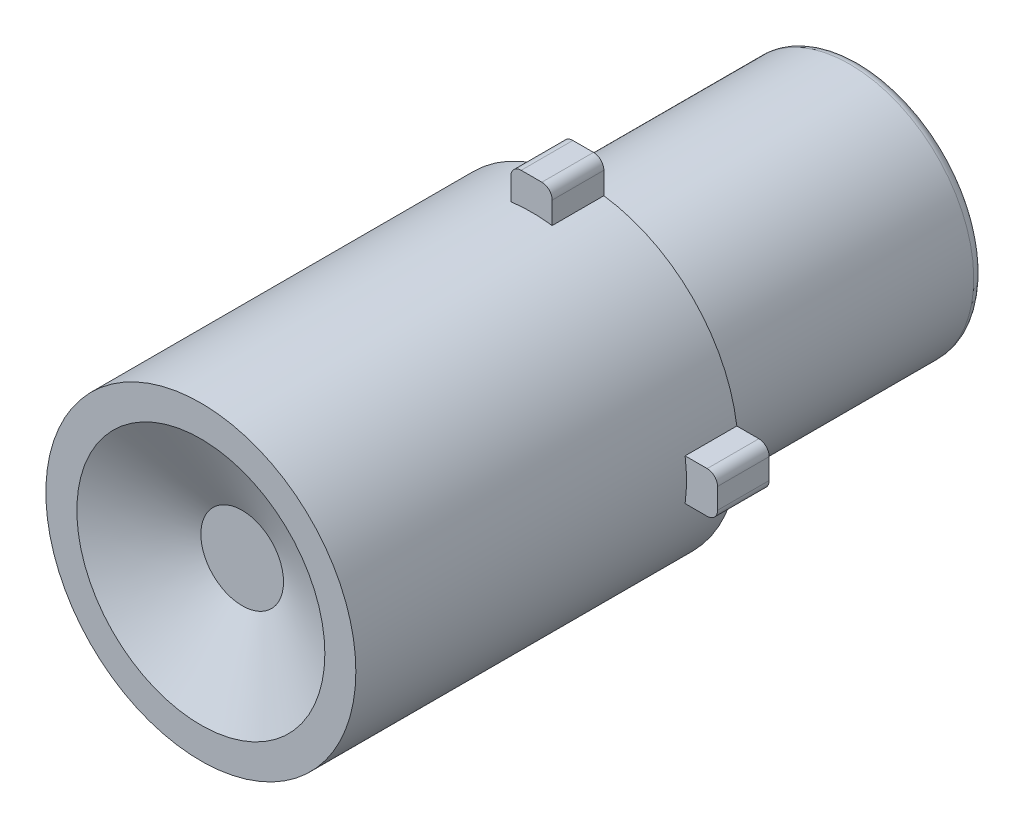
ISO-10303-21;
HEADER;
FILE_DESCRIPTION(('STEP AP214'),'2;1');
FILE_NAME('part.step','',(''),(''),'','','');
FILE_SCHEMA(('AUTOMOTIVE_DESIGN { 1 0 10303 214 1 1 1 1 }'));
ENDSEC;
DATA;
#1=APPLICATION_CONTEXT('core data for automotive mechanical design processes');
#2=APPLICATION_PROTOCOL_DEFINITION('international standard','automotive_design',2000,#1);
#3=PRODUCT_CONTEXT('',#1,'mechanical');
#4=PRODUCT('Part','Part','',(#3));
#5=PRODUCT_RELATED_PRODUCT_CATEGORY('part','',(#4));
#6=PRODUCT_DEFINITION_FORMATION('','',#4);
#7=PRODUCT_DEFINITION_CONTEXT('part definition',#1,'design');
#8=PRODUCT_DEFINITION('design','',#6,#7);
#9=PRODUCT_DEFINITION_SHAPE('','',#8);
#10=(LENGTH_UNIT() NAMED_UNIT(*) SI_UNIT(.MILLI.,.METRE.));
#11=(NAMED_UNIT(*) PLANE_ANGLE_UNIT() SI_UNIT($,.RADIAN.));
#12=(NAMED_UNIT(*) SI_UNIT($,.STERADIAN.) SOLID_ANGLE_UNIT());
#13=UNCERTAINTY_MEASURE_WITH_UNIT(LENGTH_MEASURE(1.E-05),#10,'distance_accuracy_value','');
#14=(GEOMETRIC_REPRESENTATION_CONTEXT(3) GLOBAL_UNCERTAINTY_ASSIGNED_CONTEXT((#13)) GLOBAL_UNIT_ASSIGNED_CONTEXT((#10,
#11,#12)) REPRESENTATION_CONTEXT('',''));
#15=CARTESIAN_POINT('',(0.,0.,0.));
#16=DIRECTION('',(0.,0.,1.));
#17=DIRECTION('',(1.,0.,0.));
#18=AXIS2_PLACEMENT_3D('',#15,#16,#17);
#19=CARTESIAN_POINT('',(0.,0.,10.));
#20=DIRECTION('',(0.,0.,-1.));
#21=DIRECTION('',(-1.,0.,0.));
#22=AXIS2_PLACEMENT_3D('',#19,#20,#21);
#23=CYLINDRICAL_SURFACE('',#22,3.75);
#24=CARTESIAN_POINT('',(0.,0.,10.));
#25=DIRECTION('',(0.,0.,1.));
#26=DIRECTION('',(1.,0.,0.));
#27=AXIS2_PLACEMENT_3D('',#24,#25,#26);
#28=CIRCLE('',#27,3.75);
#29=CARTESIAN_POINT('',(3.75,0.,10.));
#30=VERTEX_POINT('',#29);
#31=EDGE_CURVE('E303',#30,#30,#28,.T.);
#32=ORIENTED_EDGE('',*,*,#31,.F.);
#33=EDGE_LOOP('',(#32));
#34=FACE_BOUND('',#33,.T.);
#35=CARTESIAN_POINT('',(0.,0.,0.750000000000001));
#36=DIRECTION('',(0.,0.,-1.));
#37=DIRECTION('',(0.,1.,0.));
#38=AXIS2_PLACEMENT_3D('',#35,#36,#37);
#39=CIRCLE('',#38,3.75);
#40=CARTESIAN_POINT('',(0.5,3.71651718682963,0.750000000000001));
#41=VERTEX_POINT('',#40);
#42=CARTESIAN_POINT('',(3.71651718682963,0.5,0.749999999999999));
#43=VERTEX_POINT('',#42);
#44=EDGE_CURVE('E226',#41,#43,#39,.T.);
#45=ORIENTED_EDGE('',*,*,#44,.F.);
#46=DIRECTION('',(0.,0.,-1.));
#47=VECTOR('',#46,1.);
#48=CARTESIAN_POINT('',(0.5,3.71651718682963,10.));
#49=LINE('',#48,#47);
#50=CARTESIAN_POINT('',(0.5,3.71651718682963,2.));
#51=VERTEX_POINT('',#50);
#52=EDGE_CURVE('E268',#41,#51,#49,.F.);
#53=ORIENTED_EDGE('',*,*,#52,.T.);
#54=CARTESIAN_POINT('',(0.,0.,2.));
#55=DIRECTION('',(0.,0.,-1.));
#56=DIRECTION('',(-1.,0.,0.));
#57=AXIS2_PLACEMENT_3D('',#54,#55,#56);
#58=CIRCLE('',#57,3.75);
#59=CARTESIAN_POINT('',(-0.5,3.71651718682963,2.));
#60=VERTEX_POINT('',#59);
#61=EDGE_CURVE('E310',#60,#51,#58,.T.);
#62=ORIENTED_EDGE('',*,*,#61,.F.);
#63=DIRECTION('',(0.,0.,-1.));
#64=VECTOR('',#63,1.);
#65=CARTESIAN_POINT('',(-0.5,3.71651718682963,10.));
#66=LINE('',#65,#64);
#67=CARTESIAN_POINT('',(-0.5,3.71651718682963,0.750000000000001));
#68=VERTEX_POINT('',#67);
#69=EDGE_CURVE('E272',#60,#68,#66,.T.);
#70=ORIENTED_EDGE('',*,*,#69,.T.);
#71=CARTESIAN_POINT('',(-3.71651718682963,0.5,0.749999999999999));
#72=VERTEX_POINT('',#71);
#73=EDGE_CURVE('E486',#72,#68,#39,.T.);
#74=ORIENTED_EDGE('',*,*,#73,.F.);
#75=DIRECTION('',(0.,0.,-1.));
#76=VECTOR('',#75,1.);
#77=CARTESIAN_POINT('',(-3.71651718682963,0.500000000000001,10.));
#78=LINE('',#77,#76);
#79=CARTESIAN_POINT('',(-3.71651718682963,0.500000000000001,2.));
#80=VERTEX_POINT('',#79);
#81=EDGE_CURVE('E252',#72,#80,#78,.F.);
#82=ORIENTED_EDGE('',*,*,#81,.T.);
#83=CARTESIAN_POINT('',(0.,0.,2.));
#84=DIRECTION('',(0.,0.,-1.));
#85=DIRECTION('',(-1.,0.,0.));
#86=AXIS2_PLACEMENT_3D('',#83,#84,#85);
#87=CIRCLE('',#86,3.75);
#88=CARTESIAN_POINT('',(-3.71651718682963,-0.499999999999999,2.));
#89=VERTEX_POINT('',#88);
#90=EDGE_CURVE('E314',#89,#80,#87,.T.);
#91=ORIENTED_EDGE('',*,*,#90,.F.);
#92=DIRECTION('',(0.,0.,-1.));
#93=VECTOR('',#92,1.);
#94=CARTESIAN_POINT('',(-3.71651718682963,-0.499999999999999,10.));
#95=LINE('',#94,#93);
#96=CARTESIAN_POINT('',(-3.71651718682963,-0.5,0.750000000000001));
#97=VERTEX_POINT('',#96);
#98=EDGE_CURVE('E222',#89,#97,#95,.T.);
#99=ORIENTED_EDGE('',*,*,#98,.T.);
#100=CARTESIAN_POINT('',(-0.500000000000001,-3.71651718682963,0.749999999999999));
#101=VERTEX_POINT('',#100);
#102=EDGE_CURVE('E205',#101,#97,#39,.T.);
#103=ORIENTED_EDGE('',*,*,#102,.F.);
#104=DIRECTION('',(0.,0.,-1.));
#105=VECTOR('',#104,1.);
#106=CARTESIAN_POINT('',(-0.500000000000001,-3.71651718682963,10.));
#107=LINE('',#106,#105);
#108=CARTESIAN_POINT('',(-0.500000000000001,-3.71651718682963,2.));
#109=VERTEX_POINT('',#108);
#110=EDGE_CURVE('E219',#101,#109,#107,.F.);
#111=ORIENTED_EDGE('',*,*,#110,.T.);
#112=CARTESIAN_POINT('',(0.,0.,2.));
#113=DIRECTION('',(0.,0.,-1.));
#114=DIRECTION('',(-1.,0.,0.));
#115=AXIS2_PLACEMENT_3D('',#112,#113,#114);
#116=CIRCLE('',#115,3.75);
#117=CARTESIAN_POINT('',(0.499999999999999,-3.71651718682963,2.));
#118=VERTEX_POINT('',#117);
#119=EDGE_CURVE('E318',#118,#109,#116,.T.);
#120=ORIENTED_EDGE('',*,*,#119,.F.);
#121=DIRECTION('',(0.,0.,-1.));
#122=VECTOR('',#121,1.);
#123=CARTESIAN_POINT('',(0.499999999999999,-3.71651718682963,10.));
#124=LINE('',#123,#122);
#125=CARTESIAN_POINT('',(0.499999999999999,-3.71651718682963,0.749999999999999));
#126=VERTEX_POINT('',#125);
#127=EDGE_CURVE('E231',#118,#126,#124,.T.);
#128=ORIENTED_EDGE('',*,*,#127,.T.);
#129=CARTESIAN_POINT('',(3.71651718682963,-0.5,0.750000000000001));
#130=VERTEX_POINT('',#129);
#131=EDGE_CURVE('E224',#130,#126,#39,.T.);
#132=ORIENTED_EDGE('',*,*,#131,.F.);
#133=DIRECTION('',(0.,0.,-1.));
#134=VECTOR('',#133,1.);
#135=CARTESIAN_POINT('',(3.71651718682963,-0.5,10.));
#136=LINE('',#135,#134);
#137=CARTESIAN_POINT('',(3.71651718682963,-0.5,2.));
#138=VERTEX_POINT('',#137);
#139=EDGE_CURVE('E291',#130,#138,#136,.F.);
#140=ORIENTED_EDGE('',*,*,#139,.T.);
#141=CARTESIAN_POINT('',(0.,0.,2.));
#142=DIRECTION('',(0.,0.,1.));
#143=DIRECTION('',(1.,0.,0.));
#144=AXIS2_PLACEMENT_3D('',#141,#142,#143);
#145=CIRCLE('',#144,3.75);
#146=CARTESIAN_POINT('',(3.71651718682963,0.5,2.));
#147=VERTEX_POINT('',#146);
#148=EDGE_CURVE('E307',#138,#147,#145,.T.);
#149=ORIENTED_EDGE('',*,*,#148,.T.);
#150=DIRECTION('',(0.,0.,-1.));
#151=VECTOR('',#150,1.);
#152=CARTESIAN_POINT('',(3.71651718682963,0.5,10.));
#153=LINE('',#152,#151);
#154=EDGE_CURVE('E287',#147,#43,#153,.T.);
#155=ORIENTED_EDGE('',*,*,#154,.T.);
#156=EDGE_LOOP('',(#45,#53,#62,#70,#74,#82,#91,#99,#103,#111,#120,#128,#132,#140,#149,#155));
#157=FACE_BOUND('',#156,.T.);
#158=ADVANCED_FACE('F38',(#34,#157),#23,.T.);
#159=CARTESIAN_POINT('',(3.5,-0.5,2.));
#160=DIRECTION('',(0.,-1.,0.));
#161=DIRECTION('',(1.,0.,0.));
#162=AXIS2_PLACEMENT_3D('',#159,#160,#161);
#163=PLANE('',#162);
#164=DIRECTION('',(1.,0.,0.));
#165=VECTOR('',#164,1.);
#166=CARTESIAN_POINT('',(3.5,-0.5,0.749999999999999));
#167=LINE('',#166,#165);
#168=CARTESIAN_POINT('',(4.25,-0.5,0.749999999999999));
#169=VERTEX_POINT('',#168);
#170=EDGE_CURVE('E482',#130,#169,#167,.T.);
#171=ORIENTED_EDGE('',*,*,#170,.T.);
#172=DIRECTION('',(0.,0.,-1.));
#173=VECTOR('',#172,1.);
#174=CARTESIAN_POINT('',(4.25,-0.5,2.));
#175=LINE('',#174,#173);
#176=CARTESIAN_POINT('',(4.25,-0.5,2.));
#177=VERTEX_POINT('',#176);
#178=EDGE_CURVE('E403',#169,#177,#175,.F.);
#179=ORIENTED_EDGE('',*,*,#178,.T.);
#180=DIRECTION('',(-1.,0.,0.));
#181=VECTOR('',#180,1.);
#182=CARTESIAN_POINT('',(3.5,-0.5,2.));
#183=LINE('',#182,#181);
#184=EDGE_CURVE('E284',#177,#138,#183,.T.);
#185=ORIENTED_EDGE('',*,*,#184,.T.);
#186=ORIENTED_EDGE('',*,*,#139,.F.);
#187=EDGE_LOOP('',(#171,#179,#185,#186));
#188=FACE_BOUND('',#187,.T.);
#189=ADVANCED_FACE('F515',(#188),#163,.T.);
#190=CARTESIAN_POINT('',(3.5,0.5,2.));
#191=DIRECTION('',(0.,1.,0.));
#192=DIRECTION('',(-1.,0.,0.));
#193=AXIS2_PLACEMENT_3D('',#190,#191,#192);
#194=PLANE('',#193);
#195=DIRECTION('',(1.,0.,0.));
#196=VECTOR('',#195,1.);
#197=CARTESIAN_POINT('',(3.5,0.5,2.));
#198=LINE('',#197,#196);
#199=CARTESIAN_POINT('',(4.25,0.5,2.));
#200=VERTEX_POINT('',#199);
#201=EDGE_CURVE('E276',#147,#200,#198,.T.);
#202=ORIENTED_EDGE('',*,*,#201,.T.);
#203=DIRECTION('',(0.,0.,-1.));
#204=VECTOR('',#203,1.);
#205=CARTESIAN_POINT('',(4.25,0.5,2.));
#206=LINE('',#205,#204);
#207=CARTESIAN_POINT('',(4.25,0.5,0.749999999999999));
#208=VERTEX_POINT('',#207);
#209=EDGE_CURVE('E412',#200,#208,#206,.T.);
#210=ORIENTED_EDGE('',*,*,#209,.T.);
#211=DIRECTION('',(-1.,0.,0.));
#212=VECTOR('',#211,1.);
#213=CARTESIAN_POINT('',(3.5,0.5,0.749999999999999));
#214=LINE('',#213,#212);
#215=EDGE_CURVE('E490',#208,#43,#214,.T.);
#216=ORIENTED_EDGE('',*,*,#215,.T.);
#217=ORIENTED_EDGE('',*,*,#154,.F.);
#218=EDGE_LOOP('',(#202,#210,#216,#217));
#219=FACE_BOUND('',#218,.T.);
#220=ADVANCED_FACE('F522',(#219),#194,.T.);
#221=CARTESIAN_POINT('',(4.5,0.5,2.));
#222=DIRECTION('',(1.,0.,0.));
#223=DIRECTION('',(0.,0.,-1.));
#224=AXIS2_PLACEMENT_3D('',#221,#222,#223);
#225=PLANE('',#224);
#226=DIRECTION('',(0.,-1.,0.));
#227=VECTOR('',#226,1.);
#228=CARTESIAN_POINT('',(4.5,0.5,2.));
#229=LINE('',#228,#227);
#230=CARTESIAN_POINT('',(4.5,0.25,2.));
#231=VERTEX_POINT('',#230);
#232=CARTESIAN_POINT('',(4.5,-0.25,2.));
#233=VERTEX_POINT('',#232);
#234=EDGE_CURVE('E280',#231,#233,#229,.T.);
#235=ORIENTED_EDGE('',*,*,#234,.T.);
#236=DIRECTION('',(0.,0.,-1.));
#237=VECTOR('',#236,1.);
#238=CARTESIAN_POINT('',(4.5,-0.25,2.));
#239=LINE('',#238,#237);
#240=CARTESIAN_POINT('',(4.5,-0.25,0.749999999999999));
#241=VERTEX_POINT('',#240);
#242=EDGE_CURVE('E399',#233,#241,#239,.T.);
#243=ORIENTED_EDGE('',*,*,#242,.T.);
#244=DIRECTION('',(0.,1.,0.));
#245=VECTOR('',#244,1.);
#246=CARTESIAN_POINT('',(4.5,0.5,0.749999999999999));
#247=LINE('',#246,#245);
#248=CARTESIAN_POINT('',(4.5,0.25,0.749999999999999));
#249=VERTEX_POINT('',#248);
#250=EDGE_CURVE('E495',#241,#249,#247,.T.);
#251=ORIENTED_EDGE('',*,*,#250,.T.);
#252=DIRECTION('',(0.,0.,-1.));
#253=VECTOR('',#252,1.);
#254=CARTESIAN_POINT('',(4.5,0.25,2.));
#255=LINE('',#254,#253);
#256=EDGE_CURVE('E396',#249,#231,#255,.F.);
#257=ORIENTED_EDGE('',*,*,#256,.T.);
#258=EDGE_LOOP('',(#235,#243,#251,#257));
#259=FACE_BOUND('',#258,.T.);
#260=ADVANCED_FACE('F571',(#259),#225,.T.);
#261=CARTESIAN_POINT('',(-0.5,3.5,2.));
#262=DIRECTION('',(-1.,0.,0.));
#263=DIRECTION('',(0.,-1.,0.));
#264=AXIS2_PLACEMENT_3D('',#261,#262,#263);
#265=PLANE('',#264);
#266=DIRECTION('',(0.,1.,0.));
#267=VECTOR('',#266,1.);
#268=CARTESIAN_POINT('',(-0.5,3.5,2.));
#269=LINE('',#268,#267);
#270=CARTESIAN_POINT('',(-0.5,4.25,2.));
#271=VERTEX_POINT('',#270);
#272=EDGE_CURVE('E258',#60,#271,#269,.T.);
#273=ORIENTED_EDGE('',*,*,#272,.T.);
#274=DIRECTION('',(0.,0.,-1.));
#275=VECTOR('',#274,1.);
#276=CARTESIAN_POINT('',(-0.5,4.25,2.));
#277=LINE('',#276,#275);
#278=CARTESIAN_POINT('',(-0.5,4.25,0.75));
#279=VERTEX_POINT('',#278);
#280=EDGE_CURVE('E416',#271,#279,#277,.T.);
#281=ORIENTED_EDGE('',*,*,#280,.T.);
#282=DIRECTION('',(0.,-1.,0.));
#283=VECTOR('',#282,1.);
#284=CARTESIAN_POINT('',(-0.5,3.5,0.75));
#285=LINE('',#284,#283);
#286=EDGE_CURVE('E444',#279,#68,#285,.T.);
#287=ORIENTED_EDGE('',*,*,#286,.T.);
#288=ORIENTED_EDGE('',*,*,#69,.F.);
#289=EDGE_LOOP('',(#273,#281,#287,#288));
#290=FACE_BOUND('',#289,.T.);
#291=ADVANCED_FACE('F437',(#290),#265,.T.);
#292=CARTESIAN_POINT('',(0.5,3.5,2.));
#293=DIRECTION('',(1.,0.,0.));
#294=DIRECTION('',(0.,1.,0.));
#295=AXIS2_PLACEMENT_3D('',#292,#293,#294);
#296=PLANE('',#295);
#297=DIRECTION('',(0.,1.,0.));
#298=VECTOR('',#297,1.);
#299=CARTESIAN_POINT('',(0.5,3.5,0.75));
#300=LINE('',#299,#298);
#301=CARTESIAN_POINT('',(0.5,4.25,0.75));
#302=VERTEX_POINT('',#301);
#303=EDGE_CURVE('E455',#41,#302,#300,.T.);
#304=ORIENTED_EDGE('',*,*,#303,.T.);
#305=DIRECTION('',(0.,0.,-1.));
#306=VECTOR('',#305,1.);
#307=CARTESIAN_POINT('',(0.5,4.25,2.));
#308=LINE('',#307,#306);
#309=CARTESIAN_POINT('',(0.5,4.25,2.));
#310=VERTEX_POINT('',#309);
#311=EDGE_CURVE('E11',#302,#310,#308,.F.);
#312=ORIENTED_EDGE('',*,*,#311,.T.);
#313=DIRECTION('',(0.,-1.,0.));
#314=VECTOR('',#313,1.);
#315=CARTESIAN_POINT('',(0.5,3.5,2.));
#316=LINE('',#315,#314);
#317=EDGE_CURVE('E265',#310,#51,#316,.T.);
#318=ORIENTED_EDGE('',*,*,#317,.T.);
#319=ORIENTED_EDGE('',*,*,#52,.F.);
#320=EDGE_LOOP('',(#304,#312,#318,#319));
#321=FACE_BOUND('',#320,.T.);
#322=ADVANCED_FACE('F507',(#321),#296,.T.);
#323=CARTESIAN_POINT('',(-0.5,4.5,2.));
#324=DIRECTION('',(0.,1.,0.));
#325=DIRECTION('',(0.,0.,1.));
#326=AXIS2_PLACEMENT_3D('',#323,#324,#325);
#327=PLANE('',#326);
#328=DIRECTION('',(-1.,0.,0.));
#329=VECTOR('',#328,1.);
#330=CARTESIAN_POINT('',(-0.5,4.5,0.75));
#331=LINE('',#330,#329);
#332=CARTESIAN_POINT('',(0.25,4.5,0.75));
#333=VERTEX_POINT('',#332);
#334=CARTESIAN_POINT('',(-0.25,4.5,0.75));
#335=VERTEX_POINT('',#334);
#336=EDGE_CURVE('E442',#333,#335,#331,.T.);
#337=ORIENTED_EDGE('',*,*,#336,.T.);
#338=DIRECTION('',(0.,0.,-1.));
#339=VECTOR('',#338,1.);
#340=CARTESIAN_POINT('',(-0.25,4.5,2.));
#341=LINE('',#340,#339);
#342=CARTESIAN_POINT('',(-0.25,4.5,2.));
#343=VERTEX_POINT('',#342);
#344=EDGE_CURVE('E424',#335,#343,#341,.F.);
#345=ORIENTED_EDGE('',*,*,#344,.T.);
#346=DIRECTION('',(1.,0.,0.));
#347=VECTOR('',#346,1.);
#348=CARTESIAN_POINT('',(-0.5,4.5,2.));
#349=LINE('',#348,#347);
#350=CARTESIAN_POINT('',(0.25,4.5,2.));
#351=VERTEX_POINT('',#350);
#352=EDGE_CURVE('E262',#343,#351,#349,.T.);
#353=ORIENTED_EDGE('',*,*,#352,.T.);
#354=DIRECTION('',(0.,0.,-1.));
#355=VECTOR('',#354,1.);
#356=CARTESIAN_POINT('',(0.25,4.5,2.));
#357=LINE('',#356,#355);
#358=EDGE_CURVE('E420',#351,#333,#357,.T.);
#359=ORIENTED_EDGE('',*,*,#358,.T.);
#360=EDGE_LOOP('',(#337,#345,#353,#359));
#361=FACE_BOUND('',#360,.T.);
#362=ADVANCED_FACE('F446',(#361),#327,.T.);
#363=CARTESIAN_POINT('',(-3.5,-0.5,2.));
#364=DIRECTION('',(0.,-1.,0.));
#365=DIRECTION('',(1.,0.,0.));
#366=AXIS2_PLACEMENT_3D('',#363,#364,#365);
#367=PLANE('',#366);
#368=DIRECTION('',(-1.,0.,0.));
#369=VECTOR('',#368,1.);
#370=CARTESIAN_POINT('',(-3.5,-0.5,2.));
#371=LINE('',#370,#369);
#372=CARTESIAN_POINT('',(-4.25,-0.499999999999999,2.));
#373=VERTEX_POINT('',#372);
#374=EDGE_CURVE('E236',#89,#373,#371,.T.);
#375=ORIENTED_EDGE('',*,*,#374,.T.);
#376=DIRECTION('',(0.,0.,-1.));
#377=VECTOR('',#376,1.);
#378=CARTESIAN_POINT('',(-4.25,-0.499999999999999,2.));
#379=LINE('',#378,#377);
#380=CARTESIAN_POINT('',(-4.25,-0.499999999999999,0.749999999999999));
#381=VERTEX_POINT('',#380);
#382=EDGE_CURVE('E372',#373,#381,#379,.T.);
#383=ORIENTED_EDGE('',*,*,#382,.T.);
#384=DIRECTION('',(1.,0.,0.));
#385=VECTOR('',#384,1.);
#386=CARTESIAN_POINT('',(-3.5,-0.5,0.749999999999999));
#387=LINE('',#386,#385);
#388=EDGE_CURVE('E485',#381,#97,#387,.T.);
#389=ORIENTED_EDGE('',*,*,#388,.T.);
#390=ORIENTED_EDGE('',*,*,#98,.F.);
#391=EDGE_LOOP('',(#375,#383,#389,#390));
#392=FACE_BOUND('',#391,.T.);
#393=ADVANCED_FACE('F597',(#392),#367,.T.);
#394=CARTESIAN_POINT('',(-3.5,0.5,2.));
#395=DIRECTION('',(0.,1.,0.));
#396=DIRECTION('',(-1.,0.,0.));
#397=AXIS2_PLACEMENT_3D('',#394,#395,#396);
#398=PLANE('',#397);
#399=DIRECTION('',(-1.,0.,0.));
#400=VECTOR('',#399,1.);
#401=CARTESIAN_POINT('',(-3.5,0.5,0.749999999999999));
#402=LINE('',#401,#400);
#403=CARTESIAN_POINT('',(-4.25,0.500000000000001,0.749999999999999));
#404=VERTEX_POINT('',#403);
#405=EDGE_CURVE('E502',#72,#404,#402,.T.);
#406=ORIENTED_EDGE('',*,*,#405,.T.);
#407=DIRECTION('',(0.,0.,-1.));
#408=VECTOR('',#407,1.);
#409=CARTESIAN_POINT('',(-4.25,0.500000000000001,2.));
#410=LINE('',#409,#408);
#411=CARTESIAN_POINT('',(-4.25,0.500000000000001,2.));
#412=VERTEX_POINT('',#411);
#413=EDGE_CURVE('E363',#404,#412,#410,.F.);
#414=ORIENTED_EDGE('',*,*,#413,.T.);
#415=DIRECTION('',(1.,0.,0.));
#416=VECTOR('',#415,1.);
#417=CARTESIAN_POINT('',(-3.5,0.5,2.));
#418=LINE('',#417,#416);
#419=EDGE_CURVE('E249',#412,#80,#418,.T.);
#420=ORIENTED_EDGE('',*,*,#419,.T.);
#421=ORIENTED_EDGE('',*,*,#81,.F.);
#422=EDGE_LOOP('',(#406,#414,#420,#421));
#423=FACE_BOUND('',#422,.T.);
#424=ADVANCED_FACE('F583',(#423),#398,.T.);
#425=CARTESIAN_POINT('',(-4.5,-0.499999999999999,2.));
#426=DIRECTION('',(-1.,0.,0.));
#427=DIRECTION('',(0.,0.,1.));
#428=AXIS2_PLACEMENT_3D('',#425,#426,#427);
#429=PLANE('',#428);
#430=DIRECTION('',(0.,1.,0.));
#431=VECTOR('',#430,1.);
#432=CARTESIAN_POINT('',(-4.5,-0.499999999999999,2.));
#433=LINE('',#432,#431);
#434=CARTESIAN_POINT('',(-4.5,-0.25,2.));
#435=VERTEX_POINT('',#434);
#436=CARTESIAN_POINT('',(-4.5,0.250000000000001,2.));
#437=VERTEX_POINT('',#436);
#438=EDGE_CURVE('E245',#435,#437,#433,.T.);
#439=ORIENTED_EDGE('',*,*,#438,.T.);
#440=DIRECTION('',(0.,0.,-1.));
#441=VECTOR('',#440,1.);
#442=CARTESIAN_POINT('',(-4.5,0.250000000000001,2.));
#443=LINE('',#442,#441);
#444=CARTESIAN_POINT('',(-4.5,0.250000000000001,0.749999999999999));
#445=VERTEX_POINT('',#444);
#446=EDGE_CURVE('E336',#437,#445,#443,.T.);
#447=ORIENTED_EDGE('',*,*,#446,.T.);
#448=DIRECTION('',(0.,-1.,0.));
#449=VECTOR('',#448,1.);
#450=CARTESIAN_POINT('',(-4.5,-0.499999999999999,0.749999999999999));
#451=LINE('',#450,#449);
#452=CARTESIAN_POINT('',(-4.5,-0.25,0.749999999999999));
#453=VERTEX_POINT('',#452);
#454=EDGE_CURVE('E573',#445,#453,#451,.T.);
#455=ORIENTED_EDGE('',*,*,#454,.T.);
#456=DIRECTION('',(0.,0.,-1.));
#457=VECTOR('',#456,1.);
#458=CARTESIAN_POINT('',(-4.5,-0.25,2.));
#459=LINE('',#458,#457);
#460=EDGE_CURVE('E333',#453,#435,#459,.F.);
#461=ORIENTED_EDGE('',*,*,#460,.T.);
#462=EDGE_LOOP('',(#439,#447,#455,#461));
#463=FACE_BOUND('',#462,.T.);
#464=ADVANCED_FACE('F592',(#463),#429,.T.);
#465=CARTESIAN_POINT('',(0.499999999999999,-3.5,2.));
#466=DIRECTION('',(1.,0.,0.));
#467=DIRECTION('',(0.,1.,0.));
#468=AXIS2_PLACEMENT_3D('',#465,#466,#467);
#469=PLANE('',#468);
#470=DIRECTION('',(0.,-1.,0.));
#471=VECTOR('',#470,1.);
#472=CARTESIAN_POINT('',(0.499999999999999,-3.5,2.));
#473=LINE('',#472,#471);
#474=CARTESIAN_POINT('',(0.499999999999999,-4.25,2.));
#475=VERTEX_POINT('',#474);
#476=EDGE_CURVE('E449',#118,#475,#473,.T.);
#477=ORIENTED_EDGE('',*,*,#476,.T.);
#478=DIRECTION('',(0.,0.,-1.));
#479=VECTOR('',#478,1.);
#480=CARTESIAN_POINT('',(0.499999999999999,-4.25,2.));
#481=LINE('',#480,#479);
#482=CARTESIAN_POINT('',(0.499999999999999,-4.25,0.749999999999999));
#483=VERTEX_POINT('',#482);
#484=EDGE_CURVE('E392',#475,#483,#481,.T.);
#485=ORIENTED_EDGE('',*,*,#484,.T.);
#486=DIRECTION('',(0.,1.,0.));
#487=VECTOR('',#486,1.);
#488=CARTESIAN_POINT('',(0.499999999999999,-3.5,0.749999999999999));
#489=LINE('',#488,#487);
#490=EDGE_CURVE('E213',#483,#126,#489,.T.);
#491=ORIENTED_EDGE('',*,*,#490,.T.);
#492=ORIENTED_EDGE('',*,*,#127,.F.);
#493=EDGE_LOOP('',(#477,#485,#491,#492));
#494=FACE_BOUND('',#493,.T.);
#495=ADVANCED_FACE('F475',(#494),#469,.T.);
#496=CARTESIAN_POINT('',(-0.500000000000001,-3.5,2.));
#497=DIRECTION('',(-1.,0.,0.));
#498=DIRECTION('',(0.,-1.,0.));
#499=AXIS2_PLACEMENT_3D('',#496,#497,#498);
#500=PLANE('',#499);
#501=DIRECTION('',(0.,-1.,0.));
#502=VECTOR('',#501,1.);
#503=CARTESIAN_POINT('',(-0.500000000000001,-3.5,0.749999999999999));
#504=LINE('',#503,#502);
#505=CARTESIAN_POINT('',(-0.500000000000001,-4.25,0.749999999999999));
#506=VERTEX_POINT('',#505);
#507=EDGE_CURVE('E200',#101,#506,#504,.T.);
#508=ORIENTED_EDGE('',*,*,#507,.T.);
#509=DIRECTION('',(0.,0.,-1.));
#510=VECTOR('',#509,1.);
#511=CARTESIAN_POINT('',(-0.500000000000001,-4.25,2.));
#512=LINE('',#511,#510);
#513=CARTESIAN_POINT('',(-0.500000000000001,-4.25,2.));
#514=VERTEX_POINT('',#513);
#515=EDGE_CURVE('E383',#506,#514,#512,.F.);
#516=ORIENTED_EDGE('',*,*,#515,.T.);
#517=DIRECTION('',(0.,1.,0.));
#518=VECTOR('',#517,1.);
#519=CARTESIAN_POINT('',(-0.500000000000001,-3.5,2.));
#520=LINE('',#519,#518);
#521=EDGE_CURVE('E229',#514,#109,#520,.T.);
#522=ORIENTED_EDGE('',*,*,#521,.T.);
#523=ORIENTED_EDGE('',*,*,#110,.F.);
#524=EDGE_LOOP('',(#508,#516,#522,#523));
#525=FACE_BOUND('',#524,.T.);
#526=ADVANCED_FACE('F227',(#525),#500,.T.);
#527=CARTESIAN_POINT('',(0.499999999999999,-4.5,2.));
#528=DIRECTION('',(0.,-1.,0.));
#529=DIRECTION('',(0.,0.,-1.));
#530=AXIS2_PLACEMENT_3D('',#527,#528,#529);
#531=PLANE('',#530);
#532=DIRECTION('',(-1.,0.,0.));
#533=VECTOR('',#532,1.);
#534=CARTESIAN_POINT('',(0.499999999999999,-4.5,2.));
#535=LINE('',#534,#533);
#536=CARTESIAN_POINT('',(0.249999999999999,-4.5,2.));
#537=VERTEX_POINT('',#536);
#538=CARTESIAN_POINT('',(-0.250000000000001,-4.5,2.));
#539=VERTEX_POINT('',#538);
#540=EDGE_CURVE('E238',#537,#539,#535,.T.);
#541=ORIENTED_EDGE('',*,*,#540,.T.);
#542=DIRECTION('',(0.,0.,-1.));
#543=VECTOR('',#542,1.);
#544=CARTESIAN_POINT('',(-0.250000000000001,-4.5,2.));
#545=LINE('',#544,#543);
#546=CARTESIAN_POINT('',(-0.250000000000001,-4.5,0.749999999999999));
#547=VERTEX_POINT('',#546);
#548=EDGE_CURVE('E379',#539,#547,#545,.T.);
#549=ORIENTED_EDGE('',*,*,#548,.T.);
#550=DIRECTION('',(1.,0.,0.));
#551=VECTOR('',#550,1.);
#552=CARTESIAN_POINT('',(0.499999999999999,-4.5,0.749999999999999));
#553=LINE('',#552,#551);
#554=CARTESIAN_POINT('',(0.249999999999999,-4.5,0.749999999999999));
#555=VERTEX_POINT('',#554);
#556=EDGE_CURVE('E321',#547,#555,#553,.T.);
#557=ORIENTED_EDGE('',*,*,#556,.T.);
#558=DIRECTION('',(0.,0.,-1.));
#559=VECTOR('',#558,1.);
#560=CARTESIAN_POINT('',(0.249999999999999,-4.5,2.));
#561=LINE('',#560,#559);
#562=EDGE_CURVE('E376',#555,#537,#561,.F.);
#563=ORIENTED_EDGE('',*,*,#562,.T.);
#564=EDGE_LOOP('',(#541,#549,#557,#563));
#565=FACE_BOUND('',#564,.T.);
#566=ADVANCED_FACE('F463',(#565),#531,.T.);
#567=CARTESIAN_POINT('',(0.,0.,10.));
#568=DIRECTION('',(0.,0.,1.));
#569=DIRECTION('',(1.,0.,0.));
#570=AXIS2_PLACEMENT_3D('',#567,#568,#569);
#571=PLANE('',#570);
#572=CARTESIAN_POINT('',(0.,0.,10.));
#573=DIRECTION('',(0.,0.,1.));
#574=DIRECTION('',(1.,0.,0.));
#575=AXIS2_PLACEMENT_3D('',#572,#573,#574);
#576=CIRCLE('',#575,3.);
#577=CARTESIAN_POINT('',(3.,0.,10.));
#578=VERTEX_POINT('',#577);
#579=EDGE_CURVE('E295',#578,#578,#576,.T.);
#580=ORIENTED_EDGE('',*,*,#579,.F.);
#581=EDGE_LOOP('',(#580));
#582=FACE_BOUND('',#581,.T.);
#583=ORIENTED_EDGE('',*,*,#31,.T.);
#584=EDGE_LOOP('',(#583));
#585=FACE_BOUND('',#584,.T.);
#586=ADVANCED_FACE('F528',(#582,#585),#571,.T.);
#587=CARTESIAN_POINT('',(0.,0.,9.));
#588=DIRECTION('',(0.,0.,1.));
#589=DIRECTION('',(1.,0.,0.));
#590=AXIS2_PLACEMENT_3D('',#587,#588,#589);
#591=CONICAL_SURFACE('',#590,1.,1.10714871779409);
#592=CARTESIAN_POINT('',(0.,0.,9.));
#593=DIRECTION('',(0.,0.,1.));
#594=DIRECTION('',(1.,0.,0.));
#595=AXIS2_PLACEMENT_3D('',#592,#593,#594);
#596=CIRCLE('',#595,1.);
#597=CARTESIAN_POINT('',(0.999999999999998,0.,9.));
#598=VERTEX_POINT('',#597);
#599=EDGE_CURVE('E299',#598,#598,#596,.T.);
#600=CARTESIAN_POINT('',(3.,0.,10.));
#601=CARTESIAN_POINT('',(2.97916666666667,0.,9.98958333333333));
#602=CARTESIAN_POINT('',(2.95833333333333,0.,9.97916666666667));
#603=CARTESIAN_POINT('',(2.91666666666667,0.,9.95833333333333));
#604=CARTESIAN_POINT('',(2.89583333333333,0.,9.94791666666667));
#605=CARTESIAN_POINT('',(2.85416666666667,0.,9.92708333333333));
#606=CARTESIAN_POINT('',(2.83333333333333,0.,9.91666666666667));
#607=CARTESIAN_POINT('',(2.79166666666667,0.,9.89583333333333));
#608=CARTESIAN_POINT('',(2.77083333333333,0.,9.88541666666667));
#609=CARTESIAN_POINT('',(2.72916666666667,0.,9.86458333333333));
#610=CARTESIAN_POINT('',(2.70833333333333,0.,9.85416666666667));
#611=CARTESIAN_POINT('',(2.66666666666667,0.,9.83333333333333));
#612=CARTESIAN_POINT('',(2.64583333333333,0.,9.82291666666667));
#613=CARTESIAN_POINT('',(2.60416666666667,0.,9.80208333333333));
#614=CARTESIAN_POINT('',(2.58333333333333,0.,9.79166666666667));
#615=CARTESIAN_POINT('',(2.54166666666667,0.,9.77083333333333));
#616=CARTESIAN_POINT('',(2.52083333333333,0.,9.76041666666667));
#617=CARTESIAN_POINT('',(2.47916666666667,0.,9.73958333333333));
#618=CARTESIAN_POINT('',(2.45833333333333,0.,9.72916666666667));
#619=CARTESIAN_POINT('',(2.41666666666667,0.,9.70833333333333));
#620=CARTESIAN_POINT('',(2.39583333333333,0.,9.69791666666667));
#621=CARTESIAN_POINT('',(2.35416666666667,0.,9.67708333333333));
#622=CARTESIAN_POINT('',(2.33333333333333,0.,9.66666666666667));
#623=CARTESIAN_POINT('',(2.29166666666667,0.,9.64583333333333));
#624=CARTESIAN_POINT('',(2.27083333333333,0.,9.63541666666667));
#625=CARTESIAN_POINT('',(2.22916666666667,0.,9.61458333333333));
#626=CARTESIAN_POINT('',(2.20833333333333,0.,9.60416666666667));
#627=CARTESIAN_POINT('',(2.16666666666667,0.,9.58333333333333));
#628=CARTESIAN_POINT('',(2.14583333333333,0.,9.57291666666667));
#629=CARTESIAN_POINT('',(2.10416666666667,0.,9.55208333333333));
#630=CARTESIAN_POINT('',(2.08333333333333,0.,9.54166666666667));
#631=CARTESIAN_POINT('',(2.04166666666667,0.,9.52083333333333));
#632=CARTESIAN_POINT('',(2.02083333333333,0.,9.51041666666667));
#633=CARTESIAN_POINT('',(1.97916666666667,0.,9.48958333333333));
#634=CARTESIAN_POINT('',(1.95833333333333,0.,9.47916666666667));
#635=CARTESIAN_POINT('',(1.91666666666666,0.,9.45833333333333));
#636=CARTESIAN_POINT('',(1.89583333333333,0.,9.44791666666667));
#637=CARTESIAN_POINT('',(1.85416666666666,0.,9.42708333333333));
#638=CARTESIAN_POINT('',(1.83333333333333,0.,9.41666666666667));
#639=CARTESIAN_POINT('',(1.79166666666667,0.,9.39583333333333));
#640=CARTESIAN_POINT('',(1.77083333333333,0.,9.38541666666667));
#641=CARTESIAN_POINT('',(1.72916666666667,0.,9.36458333333333));
#642=CARTESIAN_POINT('',(1.70833333333333,0.,9.35416666666667));
#643=CARTESIAN_POINT('',(1.66666666666666,0.,9.33333333333333));
#644=CARTESIAN_POINT('',(1.64583333333333,0.,9.32291666666667));
#645=CARTESIAN_POINT('',(1.60416666666666,0.,9.30208333333333));
#646=CARTESIAN_POINT('',(1.58333333333333,0.,9.29166666666667));
#647=CARTESIAN_POINT('',(1.54166666666666,0.,9.27083333333333));
#648=CARTESIAN_POINT('',(1.52083333333333,0.,9.26041666666667));
#649=CARTESIAN_POINT('',(1.47916666666666,0.,9.23958333333333));
#650=CARTESIAN_POINT('',(1.45833333333333,0.,9.22916666666667));
#651=CARTESIAN_POINT('',(1.41666666666666,0.,9.20833333333333));
#652=CARTESIAN_POINT('',(1.39583333333333,0.,9.19791666666667));
#653=CARTESIAN_POINT('',(1.35416666666666,0.,9.17708333333333));
#654=CARTESIAN_POINT('',(1.33333333333333,0.,9.16666666666667));
#655=CARTESIAN_POINT('',(1.29166666666666,0.,9.14583333333333));
#656=CARTESIAN_POINT('',(1.27083333333333,0.,9.13541666666667));
#657=CARTESIAN_POINT('',(1.22916666666666,0.,9.11458333333333));
#658=CARTESIAN_POINT('',(1.20833333333333,0.,9.10416666666667));
#659=CARTESIAN_POINT('',(1.16666666666666,0.,9.08333333333333));
#660=CARTESIAN_POINT('',(1.14583333333333,0.,9.07291666666667));
#661=CARTESIAN_POINT('',(1.10416666666666,0.,9.05208333333333));
#662=CARTESIAN_POINT('',(1.08333333333333,0.,9.04166666666667));
#663=CARTESIAN_POINT('',(1.04166666666666,0.,9.02083333333333));
#664=CARTESIAN_POINT('',(1.02083333333333,0.,9.01041666666667));
#665=CARTESIAN_POINT('',(0.999999999999998,0.,9.));
#666=B_SPLINE_CURVE_WITH_KNOTS('',3,(#600,#601,#602,#603,#604,#605,#606,#607,#608,#609,#610,
#611,#612,#613,#614,#615,#616,#617,#618,#619,#620,#621,#622,#623,#624,#625,#626,#627,#628,#629,
#630,#631,#632,#633,#634,#635,#636,#637,#638,#639,#640,#641,#642,#643,#644,#645,#646,#647,#648,
#649,#650,#651,#652,#653,#654,#655,#656,#657,#658,#659,#660,#661,#662,#663,#664,#665),
.UNSPECIFIED.,.F.,.F.,(4,2,2,2,2,2,2,2,2,2,2,2,2,2,2,2,2,2,2,2,2,2,2,2,2,2,2,2,2,2,2,2,4),(0.,
0.0698771242968685,0.139754248593737,0.209631372890605,0.279508497187474,0.349385621484342,
0.419262745781211,0.489139870078079,0.559016994374947,0.628894118671816,0.698771242968684,
0.768648367265553,0.838525491562421,0.90840261585929,0.978279740156158,1.04815686445303,
1.11803398874989,1.18791111304676,1.25778823734363,1.3276653616405,1.39754248593737,
1.46741961023424,1.53729673453111,1.60717385882797,1.67705098312484,1.74692810742171,
1.81680523171858,1.88668235601545,1.95655948031232,2.02643660460918,2.09631372890605,
2.16619085320292,2.23606797749979),.UNSPECIFIED.);
#667=EDGE_CURVE('BSEAM622',#578,#598,#666,.T.);
#668=ORIENTED_EDGE('',*,*,#579,.T.);
#669=ORIENTED_EDGE('',*,*,#599,.F.);
#670=ORIENTED_EDGE('',*,*,#667,.T.);
#671=ORIENTED_EDGE('',*,*,#667,.F.);
#672=EDGE_LOOP('',(#668,#670,#669,#671));
#673=FACE_BOUND('',#672,.T.);
#674=ADVANCED_FACE('F622',(#673),#591,.F.);
#675=CARTESIAN_POINT('',(0.,0.,9.));
#676=DIRECTION('',(0.,0.,1.));
#677=DIRECTION('',(1.,0.,0.));
#678=AXIS2_PLACEMENT_3D('',#675,#676,#677);
#679=PLANE('',#678);
#680=ORIENTED_EDGE('',*,*,#599,.T.);
#681=EDGE_LOOP('',(#680));
#682=FACE_BOUND('',#681,.T.);
#683=ADVANCED_FACE('F615',(#682),#679,.T.);
#684=CARTESIAN_POINT('',(0.,0.,2.));
#685=DIRECTION('',(0.,0.,1.));
#686=DIRECTION('',(1.,0.,0.));
#687=AXIS2_PLACEMENT_3D('',#684,#685,#686);
#688=PLANE('',#687);
#689=ORIENTED_EDGE('',*,*,#184,.F.);
#690=CARTESIAN_POINT('',(4.25,-0.25,2.));
#691=DIRECTION('',(0.,0.,1.));
#692=DIRECTION('',(1.,0.,0.));
#693=AXIS2_PLACEMENT_3D('',#690,#691,#692);
#694=CIRCLE('',#693,0.25);
#695=EDGE_CURVE('E409',#177,#233,#694,.T.);
#696=ORIENTED_EDGE('',*,*,#695,.T.);
#697=ORIENTED_EDGE('',*,*,#234,.F.);
#698=CARTESIAN_POINT('',(4.25,0.25,2.));
#699=DIRECTION('',(0.,0.,1.));
#700=DIRECTION('',(1.,0.,0.));
#701=AXIS2_PLACEMENT_3D('',#698,#699,#700);
#702=CIRCLE('',#701,0.25);
#703=EDGE_CURVE('E406',#231,#200,#702,.T.);
#704=ORIENTED_EDGE('',*,*,#703,.T.);
#705=ORIENTED_EDGE('',*,*,#201,.F.);
#706=ORIENTED_EDGE('',*,*,#148,.F.);
#707=EDGE_LOOP('',(#689,#696,#697,#704,#705,#706));
#708=FACE_BOUND('',#707,.T.);
#709=ADVANCED_FACE('F564',(#708),#688,.T.);
#710=CARTESIAN_POINT('',(0.,0.,2.));
#711=DIRECTION('',(0.,0.,-1.));
#712=DIRECTION('',(-1.,0.,0.));
#713=AXIS2_PLACEMENT_3D('',#710,#711,#712);
#714=PLANE('',#713);
#715=ORIENTED_EDGE('',*,*,#352,.F.);
#716=CARTESIAN_POINT('',(-0.25,4.25,2.));
#717=DIRECTION('',(0.,0.,-1.));
#718=DIRECTION('',(-1.,0.,0.));
#719=AXIS2_PLACEMENT_3D('',#716,#717,#718);
#720=CIRCLE('',#719,0.25);
#721=EDGE_CURVE('E47',#343,#271,#720,.F.);
#722=ORIENTED_EDGE('',*,*,#721,.T.);
#723=ORIENTED_EDGE('',*,*,#272,.F.);
#724=ORIENTED_EDGE('',*,*,#61,.T.);
#725=ORIENTED_EDGE('',*,*,#317,.F.);
#726=CARTESIAN_POINT('',(0.25,4.25,2.));
#727=DIRECTION('',(0.,0.,-1.));
#728=DIRECTION('',(-1.,0.,0.));
#729=AXIS2_PLACEMENT_3D('',#726,#727,#728);
#730=CIRCLE('',#729,0.25);
#731=EDGE_CURVE('E59',#310,#351,#730,.F.);
#732=ORIENTED_EDGE('',*,*,#731,.T.);
#733=EDGE_LOOP('',(#715,#722,#723,#724,#725,#732));
#734=FACE_BOUND('',#733,.T.);
#735=ADVANCED_FACE('F431',(#734),#714,.F.);
#736=CARTESIAN_POINT('',(0.,0.,2.));
#737=DIRECTION('',(0.,0.,-1.));
#738=DIRECTION('',(-1.,0.,0.));
#739=AXIS2_PLACEMENT_3D('',#736,#737,#738);
#740=PLANE('',#739);
#741=ORIENTED_EDGE('',*,*,#419,.F.);
#742=CARTESIAN_POINT('',(-4.25,0.250000000000001,2.));
#743=DIRECTION('',(0.,0.,-1.));
#744=DIRECTION('',(-1.,0.,0.));
#745=AXIS2_PLACEMENT_3D('',#742,#743,#744);
#746=CIRCLE('',#745,0.25);
#747=EDGE_CURVE('E369',#412,#437,#746,.F.);
#748=ORIENTED_EDGE('',*,*,#747,.T.);
#749=ORIENTED_EDGE('',*,*,#438,.F.);
#750=CARTESIAN_POINT('',(-4.25,-0.25,2.));
#751=DIRECTION('',(0.,0.,-1.));
#752=DIRECTION('',(-1.,0.,0.));
#753=AXIS2_PLACEMENT_3D('',#750,#751,#752);
#754=CIRCLE('',#753,0.25);
#755=EDGE_CURVE('E366',#435,#373,#754,.F.);
#756=ORIENTED_EDGE('',*,*,#755,.T.);
#757=ORIENTED_EDGE('',*,*,#374,.F.);
#758=ORIENTED_EDGE('',*,*,#90,.T.);
#759=EDGE_LOOP('',(#741,#748,#749,#756,#757,#758));
#760=FACE_BOUND('',#759,.T.);
#761=ADVANCED_FACE('F589',(#760),#740,.F.);
#762=CARTESIAN_POINT('',(0.,0.,2.));
#763=DIRECTION('',(0.,0.,-1.));
#764=DIRECTION('',(-1.,0.,0.));
#765=AXIS2_PLACEMENT_3D('',#762,#763,#764);
#766=PLANE('',#765);
#767=ORIENTED_EDGE('',*,*,#521,.F.);
#768=CARTESIAN_POINT('',(-0.250000000000001,-4.25,2.));
#769=DIRECTION('',(0.,0.,-1.));
#770=DIRECTION('',(-1.,0.,0.));
#771=AXIS2_PLACEMENT_3D('',#768,#769,#770);
#772=CIRCLE('',#771,0.25);
#773=EDGE_CURVE('E389',#514,#539,#772,.F.);
#774=ORIENTED_EDGE('',*,*,#773,.T.);
#775=ORIENTED_EDGE('',*,*,#540,.F.);
#776=CARTESIAN_POINT('',(0.249999999999999,-4.25,2.));
#777=DIRECTION('',(0.,0.,-1.));
#778=DIRECTION('',(-1.,0.,0.));
#779=AXIS2_PLACEMENT_3D('',#776,#777,#778);
#780=CIRCLE('',#779,0.25);
#781=EDGE_CURVE('E386',#537,#475,#780,.F.);
#782=ORIENTED_EDGE('',*,*,#781,.T.);
#783=ORIENTED_EDGE('',*,*,#476,.F.);
#784=ORIENTED_EDGE('',*,*,#119,.T.);
#785=EDGE_LOOP('',(#767,#774,#775,#782,#783,#784));
#786=FACE_BOUND('',#785,.T.);
#787=ADVANCED_FACE('F470',(#786),#766,.F.);
#788=CARTESIAN_POINT('',(6.5,6.76660228947352,0.75));
#789=DIRECTION('',(0.,0.,-1.));
#790=DIRECTION('',(0.,1.,0.));
#791=AXIS2_PLACEMENT_3D('',#788,#789,#790);
#792=PLANE('',#791);
#793=CARTESIAN_POINT('',(0.,0.,0.749999999999999));
#794=DIRECTION('',(0.,0.,-1.));
#795=DIRECTION('',(0.,1.,0.));
#796=AXIS2_PLACEMENT_3D('',#793,#794,#795);
#797=CIRCLE('',#796,3.);
#798=CARTESIAN_POINT('',(0.,3.,0.75));
#799=VERTEX_POINT('',#798);
#800=EDGE_CURVE('E214',#799,#799,#797,.T.);
#801=ORIENTED_EDGE('',*,*,#800,.F.);
#802=EDGE_LOOP('',(#801));
#803=FACE_BOUND('',#802,.T.);
#804=ORIENTED_EDGE('',*,*,#454,.F.);
#805=CARTESIAN_POINT('',(-4.25,0.250000000000001,0.749999999999999));
#806=DIRECTION('',(0.,0.,-1.));
#807=DIRECTION('',(0.,1.,0.));
#808=AXIS2_PLACEMENT_3D('',#805,#806,#807);
#809=CIRCLE('',#808,0.25);
#810=EDGE_CURVE('E360',#445,#404,#809,.T.);
#811=ORIENTED_EDGE('',*,*,#810,.T.);
#812=ORIENTED_EDGE('',*,*,#405,.F.);
#813=ORIENTED_EDGE('',*,*,#73,.T.);
#814=ORIENTED_EDGE('',*,*,#286,.F.);
#815=CARTESIAN_POINT('',(-0.25,4.25,0.75));
#816=DIRECTION('',(0.,0.,-1.));
#817=DIRECTION('',(0.,1.,0.));
#818=AXIS2_PLACEMENT_3D('',#815,#816,#817);
#819=CIRCLE('',#818,0.25);
#820=EDGE_CURVE('E343',#279,#335,#819,.T.);
#821=ORIENTED_EDGE('',*,*,#820,.T.);
#822=ORIENTED_EDGE('',*,*,#336,.F.);
#823=CARTESIAN_POINT('',(0.25,4.25,0.75));
#824=DIRECTION('',(0.,0.,-1.));
#825=DIRECTION('',(0.,1.,0.));
#826=AXIS2_PLACEMENT_3D('',#823,#824,#825);
#827=CIRCLE('',#826,0.25);
#828=EDGE_CURVE('E340',#333,#302,#827,.T.);
#829=ORIENTED_EDGE('',*,*,#828,.T.);
#830=ORIENTED_EDGE('',*,*,#303,.F.);
#831=ORIENTED_EDGE('',*,*,#44,.T.);
#832=ORIENTED_EDGE('',*,*,#215,.F.);
#833=CARTESIAN_POINT('',(4.25,0.25,0.749999999999999));
#834=DIRECTION('',(0.,0.,-1.));
#835=DIRECTION('',(0.,1.,0.));
#836=AXIS2_PLACEMENT_3D('',#833,#834,#835);
#837=CIRCLE('',#836,0.25);
#838=EDGE_CURVE('E346',#208,#249,#837,.T.);
#839=ORIENTED_EDGE('',*,*,#838,.T.);
#840=ORIENTED_EDGE('',*,*,#250,.F.);
#841=CARTESIAN_POINT('',(4.25,-0.25,0.749999999999999));
#842=DIRECTION('',(0.,0.,-1.));
#843=DIRECTION('',(0.,1.,0.));
#844=AXIS2_PLACEMENT_3D('',#841,#842,#843);
#845=CIRCLE('',#844,0.25);
#846=EDGE_CURVE('E349',#241,#169,#845,.T.);
#847=ORIENTED_EDGE('',*,*,#846,.T.);
#848=ORIENTED_EDGE('',*,*,#170,.F.);
#849=ORIENTED_EDGE('',*,*,#131,.T.);
#850=ORIENTED_EDGE('',*,*,#490,.F.);
#851=CARTESIAN_POINT('',(0.249999999999999,-4.25,0.749999999999999));
#852=DIRECTION('',(0.,0.,-1.));
#853=DIRECTION('',(0.,1.,0.));
#854=AXIS2_PLACEMENT_3D('',#851,#852,#853);
#855=CIRCLE('',#854,0.25);
#856=EDGE_CURVE('E352',#483,#555,#855,.T.);
#857=ORIENTED_EDGE('',*,*,#856,.T.);
#858=ORIENTED_EDGE('',*,*,#556,.F.);
#859=CARTESIAN_POINT('',(-0.250000000000001,-4.25,0.749999999999999));
#860=DIRECTION('',(0.,0.,-1.));
#861=DIRECTION('',(0.,1.,0.));
#862=AXIS2_PLACEMENT_3D('',#859,#860,#861);
#863=CIRCLE('',#862,0.25);
#864=EDGE_CURVE('E208',#547,#506,#863,.T.);
#865=ORIENTED_EDGE('',*,*,#864,.T.);
#866=ORIENTED_EDGE('',*,*,#507,.F.);
#867=ORIENTED_EDGE('',*,*,#102,.T.);
#868=ORIENTED_EDGE('',*,*,#388,.F.);
#869=CARTESIAN_POINT('',(-4.25,-0.25,0.749999999999999));
#870=DIRECTION('',(0.,0.,-1.));
#871=DIRECTION('',(0.,1.,0.));
#872=AXIS2_PLACEMENT_3D('',#869,#870,#871);
#873=CIRCLE('',#872,0.25);
#874=EDGE_CURVE('E357',#381,#453,#873,.T.);
#875=ORIENTED_EDGE('',*,*,#874,.T.);
#876=EDGE_LOOP('',(#804,#811,#812,#813,#814,#821,#822,#829,#830,#831,#832,#839,#840,#847,#848,
#849,#850,#857,#858,#865,#866,#867,#868,#875));
#877=FACE_BOUND('',#876,.T.);
#878=ADVANCED_FACE('F203',(#803,#877),#792,.T.);
#879=CARTESIAN_POINT('',(0.,0.,-5.95));
#880=DIRECTION('',(0.,0.,1.));
#881=DIRECTION('',(0.,-1.,0.));
#882=AXIS2_PLACEMENT_3D('',#879,#880,#881);
#883=CYLINDRICAL_SURFACE('',#882,3.);
#884=CARTESIAN_POINT('',(0.,0.,-5.7));
#885=DIRECTION('',(0.,0.,-1.));
#886=DIRECTION('',(0.,1.,0.));
#887=AXIS2_PLACEMENT_3D('',#884,#885,#886);
#888=CIRCLE('',#887,3.);
#889=CARTESIAN_POINT('',(0.,3.,-5.7));
#890=VERTEX_POINT('',#889);
#891=EDGE_CURVE('E329',#890,#890,#888,.F.);
#892=ORIENTED_EDGE('',*,*,#891,.T.);
#893=EDGE_LOOP('',(#892));
#894=FACE_BOUND('',#893,.T.);
#895=ORIENTED_EDGE('',*,*,#800,.T.);
#896=EDGE_LOOP('',(#895));
#897=FACE_BOUND('',#896,.T.);
#898=ADVANCED_FACE('F653',(#894,#897),#883,.T.);
#899=CARTESIAN_POINT('',(0.,0.,-5.95));
#900=DIRECTION('',(0.,0.,-1.));
#901=DIRECTION('',(0.,1.,0.));
#902=AXIS2_PLACEMENT_3D('',#899,#900,#901);
#903=PLANE('',#902);
#904=CARTESIAN_POINT('',(0.,0.,-5.95));
#905=DIRECTION('',(0.,0.,-1.));
#906=DIRECTION('',(0.,1.,0.));
#907=AXIS2_PLACEMENT_3D('',#904,#905,#906);
#908=CIRCLE('',#907,2.75);
#909=CARTESIAN_POINT('',(0.,2.75,-5.95));
#910=VERTEX_POINT('',#909);
#911=EDGE_CURVE('E325',#910,#910,#908,.T.);
#912=ORIENTED_EDGE('',*,*,#911,.T.);
#913=EDGE_LOOP('',(#912));
#914=FACE_BOUND('',#913,.T.);
#915=CARTESIAN_POINT('',(0.,0.,-5.95));
#916=DIRECTION('',(0.,0.,-1.));
#917=DIRECTION('',(0.,1.,0.));
#918=AXIS2_PLACEMENT_3D('',#915,#916,#917);
#919=CIRCLE('',#918,2.5);
#920=CARTESIAN_POINT('',(0.,2.5,-5.95));
#921=VERTEX_POINT('',#920);
#922=EDGE_CURVE('E676',#921,#921,#919,.T.);
#923=ORIENTED_EDGE('',*,*,#922,.F.);
#924=EDGE_LOOP('',(#923));
#925=FACE_BOUND('',#924,.T.);
#926=ADVANCED_FACE('F659',(#914,#925),#903,.T.);
#927=CARTESIAN_POINT('',(0.,0.,-4.7));
#928=DIRECTION('',(0.,0.,-1.));
#929=DIRECTION('',(0.,1.,0.));
#930=AXIS2_PLACEMENT_3D('',#927,#928,#929);
#931=CYLINDRICAL_SURFACE('',#930,2.5);
#932=CARTESIAN_POINT('',(0.,0.,-4.7));
#933=DIRECTION('',(0.,0.,-1.));
#934=DIRECTION('',(0.,1.,0.));
#935=AXIS2_PLACEMENT_3D('',#932,#933,#934);
#936=CIRCLE('',#935,2.5);
#937=CARTESIAN_POINT('',(0.,2.5,-4.7));
#938=VERTEX_POINT('',#937);
#939=EDGE_CURVE('E674',#938,#938,#936,.T.);
#940=ORIENTED_EDGE('',*,*,#939,.F.);
#941=EDGE_LOOP('',(#940));
#942=FACE_BOUND('',#941,.T.);
#943=ORIENTED_EDGE('',*,*,#922,.T.);
#944=EDGE_LOOP('',(#943));
#945=FACE_BOUND('',#944,.T.);
#946=ADVANCED_FACE('F663',(#942,#945),#931,.F.);
#947=CARTESIAN_POINT('',(0.,0.,-4.7));
#948=DIRECTION('',(0.,0.,-1.));
#949=DIRECTION('',(0.,1.,0.));
#950=AXIS2_PLACEMENT_3D('',#947,#948,#949);
#951=PLANE('',#950);
#952=ORIENTED_EDGE('',*,*,#939,.T.);
#953=EDGE_LOOP('',(#952));
#954=FACE_BOUND('',#953,.T.);
#955=ADVANCED_FACE('F534',(#954),#951,.T.);
#956=CARTESIAN_POINT('',(0.,0.,-5.7));
#957=DIRECTION('',(0.,0.,-1.));
#958=DIRECTION('',(0.,1.,0.));
#959=AXIS2_PLACEMENT_3D('',#956,#957,#958);
#960=TOROIDAL_SURFACE('',#959,2.75,0.25);
#961=ORIENTED_EDGE('',*,*,#891,.F.);
#962=EDGE_LOOP('',(#961));
#963=FACE_BOUND('',#962,.T.);
#964=ORIENTED_EDGE('',*,*,#911,.F.);
#965=EDGE_LOOP('',(#964));
#966=FACE_BOUND('',#965,.T.);
#967=ADVANCED_FACE('F530',(#963,#966),#960,.T.);
#968=CARTESIAN_POINT('',(-4.25,0.250000000000001,2.));
#969=DIRECTION('',(0.,0.,-1.));
#970=DIRECTION('',(-1.,0.,0.));
#971=AXIS2_PLACEMENT_3D('',#968,#969,#970);
#972=CYLINDRICAL_SURFACE('',#971,0.25);
#973=ORIENTED_EDGE('',*,*,#747,.F.);
#974=ORIENTED_EDGE('',*,*,#413,.F.);
#975=ORIENTED_EDGE('',*,*,#810,.F.);
#976=ORIENTED_EDGE('',*,*,#446,.F.);
#977=EDGE_LOOP('',(#973,#974,#975,#976));
#978=FACE_BOUND('',#977,.T.);
#979=ADVANCED_FACE('F533',(#978),#972,.T.);
#980=CARTESIAN_POINT('',(-4.25,-0.25,2.));
#981=DIRECTION('',(0.,0.,-1.));
#982=DIRECTION('',(-1.,0.,0.));
#983=AXIS2_PLACEMENT_3D('',#980,#981,#982);
#984=CYLINDRICAL_SURFACE('',#983,0.25);
#985=ORIENTED_EDGE('',*,*,#755,.F.);
#986=ORIENTED_EDGE('',*,*,#460,.F.);
#987=ORIENTED_EDGE('',*,*,#874,.F.);
#988=ORIENTED_EDGE('',*,*,#382,.F.);
#989=EDGE_LOOP('',(#985,#986,#987,#988));
#990=FACE_BOUND('',#989,.T.);
#991=ADVANCED_FACE('F538',(#990),#984,.T.);
#992=CARTESIAN_POINT('',(-0.250000000000001,-4.25,2.));
#993=DIRECTION('',(0.,0.,-1.));
#994=DIRECTION('',(-1.,0.,0.));
#995=AXIS2_PLACEMENT_3D('',#992,#993,#994);
#996=CYLINDRICAL_SURFACE('',#995,0.25);
#997=ORIENTED_EDGE('',*,*,#773,.F.);
#998=ORIENTED_EDGE('',*,*,#515,.F.);
#999=ORIENTED_EDGE('',*,*,#864,.F.);
#1000=ORIENTED_EDGE('',*,*,#548,.F.);
#1001=EDGE_LOOP('',(#997,#998,#999,#1000));
#1002=FACE_BOUND('',#1001,.T.);
#1003=ADVANCED_FACE('F469',(#1002),#996,.T.);
#1004=CARTESIAN_POINT('',(0.249999999999999,-4.25,2.));
#1005=DIRECTION('',(0.,0.,-1.));
#1006=DIRECTION('',(-1.,0.,0.));
#1007=AXIS2_PLACEMENT_3D('',#1004,#1005,#1006);
#1008=CYLINDRICAL_SURFACE('',#1007,0.25);
#1009=ORIENTED_EDGE('',*,*,#781,.F.);
#1010=ORIENTED_EDGE('',*,*,#562,.F.);
#1011=ORIENTED_EDGE('',*,*,#856,.F.);
#1012=ORIENTED_EDGE('',*,*,#484,.F.);
#1013=EDGE_LOOP('',(#1009,#1010,#1011,#1012));
#1014=FACE_BOUND('',#1013,.T.);
#1015=ADVANCED_FACE('F545',(#1014),#1008,.T.);
#1016=CARTESIAN_POINT('',(4.25,-0.25,2.));
#1017=DIRECTION('',(0.,0.,-1.));
#1018=DIRECTION('',(-1.,0.,0.));
#1019=AXIS2_PLACEMENT_3D('',#1016,#1017,#1018);
#1020=CYLINDRICAL_SURFACE('',#1019,0.25);
#1021=ORIENTED_EDGE('',*,*,#695,.F.);
#1022=ORIENTED_EDGE('',*,*,#178,.F.);
#1023=ORIENTED_EDGE('',*,*,#846,.F.);
#1024=ORIENTED_EDGE('',*,*,#242,.F.);
#1025=EDGE_LOOP('',(#1021,#1022,#1023,#1024));
#1026=FACE_BOUND('',#1025,.T.);
#1027=ADVANCED_FACE('F548',(#1026),#1020,.T.);
#1028=CARTESIAN_POINT('',(4.25,0.25,2.));
#1029=DIRECTION('',(0.,0.,-1.));
#1030=DIRECTION('',(-1.,0.,0.));
#1031=AXIS2_PLACEMENT_3D('',#1028,#1029,#1030);
#1032=CYLINDRICAL_SURFACE('',#1031,0.25);
#1033=ORIENTED_EDGE('',*,*,#703,.F.);
#1034=ORIENTED_EDGE('',*,*,#256,.F.);
#1035=ORIENTED_EDGE('',*,*,#838,.F.);
#1036=ORIENTED_EDGE('',*,*,#209,.F.);
#1037=EDGE_LOOP('',(#1033,#1034,#1035,#1036));
#1038=FACE_BOUND('',#1037,.T.);
#1039=ADVANCED_FACE('F513',(#1038),#1032,.T.);
#1040=CARTESIAN_POINT('',(-0.25,4.25,2.));
#1041=DIRECTION('',(0.,0.,-1.));
#1042=DIRECTION('',(-1.,0.,0.));
#1043=AXIS2_PLACEMENT_3D('',#1040,#1041,#1042);
#1044=CYLINDRICAL_SURFACE('',#1043,0.25);
#1045=ORIENTED_EDGE('',*,*,#721,.F.);
#1046=ORIENTED_EDGE('',*,*,#344,.F.);
#1047=ORIENTED_EDGE('',*,*,#820,.F.);
#1048=ORIENTED_EDGE('',*,*,#280,.F.);
#1049=EDGE_LOOP('',(#1045,#1046,#1047,#1048));
#1050=FACE_BOUND('',#1049,.T.);
#1051=ADVANCED_FACE('F439',(#1050),#1044,.T.);
#1052=CARTESIAN_POINT('',(0.25,4.25,2.));
#1053=DIRECTION('',(0.,0.,-1.));
#1054=DIRECTION('',(-1.,0.,0.));
#1055=AXIS2_PLACEMENT_3D('',#1052,#1053,#1054);
#1056=CYLINDRICAL_SURFACE('',#1055,0.25);
#1057=ORIENTED_EDGE('',*,*,#731,.F.);
#1058=ORIENTED_EDGE('',*,*,#311,.F.);
#1059=ORIENTED_EDGE('',*,*,#828,.F.);
#1060=ORIENTED_EDGE('',*,*,#358,.F.);
#1061=EDGE_LOOP('',(#1057,#1058,#1059,#1060));
#1062=FACE_BOUND('',#1061,.T.);
#1063=ADVANCED_FACE('F40',(#1062),#1056,.T.);
#1064=CLOSED_SHELL('',(#158,#189,#220,#260,#291,#322,#362,#393,#424,#464,#495,#526,#566,#586,
#674,#683,#709,#735,#761,#787,#878,#898,#926,#946,#955,#967,#979,#991,#1003,#1015,#1027,#1039,
#1051,#1063));
#1065=MANIFOLD_SOLID_BREP('B2',#1064);
#1066=ADVANCED_BREP_SHAPE_REPRESENTATION('',(#18,#1065),#14);
#1067=SHAPE_DEFINITION_REPRESENTATION(#9,#1066);
ENDSEC;
END-ISO-10303-21;
